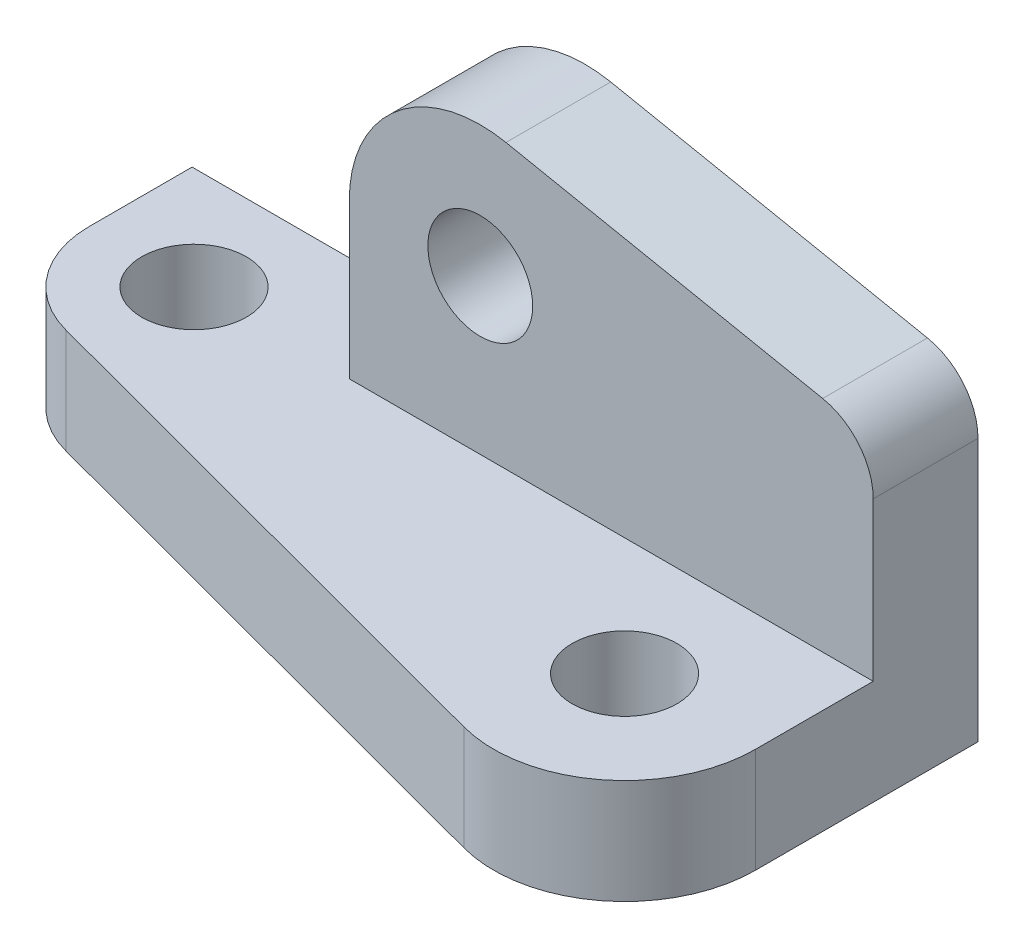
ISO-10303-21;
HEADER;
FILE_DESCRIPTION(('STEP AP214'),'2;1');
FILE_NAME('part.step','',(''),(''),'','','');
FILE_SCHEMA(('AUTOMOTIVE_DESIGN { 1 0 10303 214 1 1 1 1 }'));
ENDSEC;
DATA;
#1=APPLICATION_CONTEXT('core data for automotive mechanical design processes');
#2=APPLICATION_PROTOCOL_DEFINITION('international standard','automotive_design',2000,#1);
#3=PRODUCT_CONTEXT('',#1,'mechanical');
#4=PRODUCT('Part','Part','',(#3));
#5=PRODUCT_RELATED_PRODUCT_CATEGORY('part','',(#4));
#6=PRODUCT_DEFINITION_FORMATION('','',#4);
#7=PRODUCT_DEFINITION_CONTEXT('part definition',#1,'design');
#8=PRODUCT_DEFINITION('design','',#6,#7);
#9=PRODUCT_DEFINITION_SHAPE('','',#8);
#10=(LENGTH_UNIT() NAMED_UNIT(*) SI_UNIT(.MILLI.,.METRE.));
#11=(NAMED_UNIT(*) PLANE_ANGLE_UNIT() SI_UNIT($,.RADIAN.));
#12=(NAMED_UNIT(*) SI_UNIT($,.STERADIAN.) SOLID_ANGLE_UNIT());
#13=UNCERTAINTY_MEASURE_WITH_UNIT(LENGTH_MEASURE(1.E-05),#10,'distance_accuracy_value','');
#14=(GEOMETRIC_REPRESENTATION_CONTEXT(3) GLOBAL_UNCERTAINTY_ASSIGNED_CONTEXT((#13)) GLOBAL_UNIT_ASSIGNED_CONTEXT((#10,
#11,#12)) REPRESENTATION_CONTEXT('',''));
#15=CARTESIAN_POINT('',(0.,0.,0.));
#16=DIRECTION('',(0.,0.,1.));
#17=DIRECTION('',(1.,0.,0.));
#18=AXIS2_PLACEMENT_3D('',#15,#16,#17);
#19=CARTESIAN_POINT('',(0.,20.,35.));
#20=DIRECTION('',(1.,0.,0.));
#21=DIRECTION('',(0.,0.,-1.));
#22=AXIS2_PLACEMENT_3D('',#19,#20,#21);
#23=PLANE('',#22);
#24=DIRECTION('',(0.,0.,1.));
#25=VECTOR('',#24,1.);
#26=CARTESIAN_POINT('',(0.,0.,35.));
#27=LINE('',#26,#25);
#28=CARTESIAN_POINT('',(0.,0.,0.));
#29=VERTEX_POINT('',#28);
#30=CARTESIAN_POINT('',(0.,0.,19.63443373832));
#31=VERTEX_POINT('',#30);
#32=EDGE_CURVE('E136',#29,#31,#27,.T.);
#33=ORIENTED_EDGE('',*,*,#32,.T.);
#34=DIRECTION('',(0.,-1.,0.));
#35=VECTOR('',#34,1.);
#36=CARTESIAN_POINT('',(0.,20.,19.63443373832));
#37=LINE('',#36,#35);
#38=CARTESIAN_POINT('',(0.,20.,19.63443373832));
#39=VERTEX_POINT('',#38);
#40=EDGE_CURVE('E187',#31,#39,#37,.F.);
#41=ORIENTED_EDGE('',*,*,#40,.T.);
#42=DIRECTION('',(0.,0.,1.));
#43=VECTOR('',#42,1.);
#44=CARTESIAN_POINT('',(0.,20.,35.));
#45=LINE('',#44,#43);
#46=CARTESIAN_POINT('',(0.,20.,0.));
#47=VERTEX_POINT('',#46);
#48=EDGE_CURVE('E155',#47,#39,#45,.T.);
#49=ORIENTED_EDGE('',*,*,#48,.F.);
#50=DIRECTION('',(0.,-1.,0.));
#51=VECTOR('',#50,1.);
#52=CARTESIAN_POINT('',(0.,20.,0.));
#53=LINE('',#52,#51);
#54=EDGE_CURVE('E122',#47,#29,#53,.T.);
#55=ORIENTED_EDGE('',*,*,#54,.T.);
#56=EDGE_LOOP('',(#33,#41,#49,#55));
#57=FACE_BOUND('',#56,.T.);
#58=ADVANCED_FACE('F33',(#57),#23,.F.);
#59=CARTESIAN_POINT('',(150.,20.,75.));
#60=DIRECTION('',(0.257662650560332,0.,-0.966234939601246));
#61=DIRECTION('',(-0.966234939601246,0.,-0.257662650560332));
#62=AXIS2_PLACEMENT_3D('',#59,#60,#61);
#63=PLANE('',#62);
#64=DIRECTION('',(0.966234939601246,0.,0.257662650560332));
#65=VECTOR('',#64,1.);
#66=CARTESIAN_POINT('',(150.,0.,75.));
#67=LINE('',#66,#65);
#68=CARTESIAN_POINT('',(14.8467469887934,0.,38.9591325303449));
#69=VERTEX_POINT('',#68);
#70=CARTESIAN_POINT('',(118.558433735992,0.,66.6155823295978));
#71=VERTEX_POINT('',#70);
#72=EDGE_CURVE('E163',#69,#71,#67,.T.);
#73=ORIENTED_EDGE('',*,*,#72,.T.);
#74=DIRECTION('',(0.,-1.,0.));
#75=VECTOR('',#74,1.);
#76=CARTESIAN_POINT('',(118.558433735992,20.,66.6155823295978));
#77=LINE('',#76,#75);
#78=CARTESIAN_POINT('',(118.558433735992,20.,66.6155823295978));
#79=VERTEX_POINT('',#78);
#80=EDGE_CURVE('E41',#71,#79,#77,.F.);
#81=ORIENTED_EDGE('',*,*,#80,.T.);
#82=DIRECTION('',(0.966234939601246,0.,0.257662650560332));
#83=VECTOR('',#82,1.);
#84=CARTESIAN_POINT('',(150.,20.,75.));
#85=LINE('',#84,#83);
#86=CARTESIAN_POINT('',(14.8467469887934,20.,38.9591325303449));
#87=VERTEX_POINT('',#86);
#88=EDGE_CURVE('E157',#87,#79,#85,.T.);
#89=ORIENTED_EDGE('',*,*,#88,.F.);
#90=DIRECTION('',(0.,-1.,0.));
#91=VECTOR('',#90,1.);
#92=CARTESIAN_POINT('',(14.8467469887933,20.,38.9591325303449));
#93=LINE('',#92,#91);
#94=EDGE_CURVE('E182',#87,#69,#93,.T.);
#95=ORIENTED_EDGE('',*,*,#94,.T.);
#96=EDGE_LOOP('',(#73,#81,#89,#95));
#97=FACE_BOUND('',#96,.T.);
#98=ADVANCED_FACE('F218',(#97),#63,.F.);
#99=CARTESIAN_POINT('',(150.,20.,0.));
#100=DIRECTION('',(-1.,0.,0.));
#101=DIRECTION('',(0.,0.,1.));
#102=AXIS2_PLACEMENT_3D('',#99,#100,#101);
#103=PLANE('',#102);
#104=DIRECTION('',(0.,0.,-1.));
#105=VECTOR('',#104,1.);
#106=CARTESIAN_POINT('',(150.,20.,0.));
#107=LINE('',#106,#105);
#108=CARTESIAN_POINT('',(150.,20.,42.4597088395666));
#109=VERTEX_POINT('',#108);
#110=CARTESIAN_POINT('',(150.,20.,20.));
#111=VERTEX_POINT('',#110);
#112=EDGE_CURVE('E126',#109,#111,#107,.T.);
#113=ORIENTED_EDGE('',*,*,#112,.F.);
#114=DIRECTION('',(0.,-1.,0.));
#115=VECTOR('',#114,1.);
#116=CARTESIAN_POINT('',(150.,20.,42.4597088395666));
#117=LINE('',#116,#115);
#118=CARTESIAN_POINT('',(150.,0.,42.4597088395666));
#119=VERTEX_POINT('',#118);
#120=EDGE_CURVE('E198',#109,#119,#117,.T.);
#121=ORIENTED_EDGE('',*,*,#120,.T.);
#122=DIRECTION('',(0.,0.,-1.));
#123=VECTOR('',#122,1.);
#124=CARTESIAN_POINT('',(150.,0.,0.));
#125=LINE('',#124,#123);
#126=CARTESIAN_POINT('',(150.,0.,0.));
#127=VERTEX_POINT('',#126);
#128=EDGE_CURVE('E165',#119,#127,#125,.T.);
#129=ORIENTED_EDGE('',*,*,#128,.T.);
#130=DIRECTION('',(0.,-1.,0.));
#131=VECTOR('',#130,1.);
#132=CARTESIAN_POINT('',(150.,20.,0.));
#133=LINE('',#132,#131);
#134=CARTESIAN_POINT('',(150.,50.1623531673773,0.));
#135=VERTEX_POINT('',#134);
#136=EDGE_CURVE('E169',#135,#127,#133,.T.);
#137=ORIENTED_EDGE('',*,*,#136,.F.);
#138=DIRECTION('',(0.,0.,-1.));
#139=VECTOR('',#138,1.);
#140=CARTESIAN_POINT('',(150.,50.1623531673773,20.));
#141=LINE('',#140,#139);
#142=CARTESIAN_POINT('',(150.,50.1623531673773,20.));
#143=VERTEX_POINT('',#142);
#144=EDGE_CURVE('E177',#135,#143,#141,.F.);
#145=ORIENTED_EDGE('',*,*,#144,.T.);
#146=DIRECTION('',(0.,-1.,0.));
#147=VECTOR('',#146,1.);
#148=CARTESIAN_POINT('',(150.,0.,20.));
#149=LINE('',#148,#147);
#150=EDGE_CURVE('E151',#143,#111,#149,.T.);
#151=ORIENTED_EDGE('',*,*,#150,.T.);
#152=EDGE_LOOP('',(#113,#121,#129,#137,#145,#151));
#153=FACE_BOUND('',#152,.T.);
#154=ADVANCED_FACE('F204',(#153),#103,.F.);
#155=CARTESIAN_POINT('',(0.,20.,0.));
#156=DIRECTION('',(0.,0.,1.));
#157=DIRECTION('',(1.,0.,0.));
#158=AXIS2_PLACEMENT_3D('',#155,#156,#157);
#159=PLANE('',#158);
#160=CARTESIAN_POINT('',(75.,49.5049024320361,0.));
#161=DIRECTION('',(0.,0.,1.));
#162=DIRECTION('',(1.,0.,0.));
#163=AXIS2_PLACEMENT_3D('',#160,#161,#162);
#164=CIRCLE('',#163,9.99999999999999);
#165=CARTESIAN_POINT('',(85.,49.5049024320361,0.));
#166=VERTEX_POINT('',#165);
#167=EDGE_CURVE('E388',#166,#166,#164,.T.);
#168=ORIENTED_EDGE('',*,*,#167,.T.);
#169=EDGE_LOOP('',(#168));
#170=FACE_BOUND('',#169,.T.);
#171=DIRECTION('',(0.,1.,0.));
#172=VECTOR('',#171,1.);
#173=CARTESIAN_POINT('',(50.,80.,0.));
#174=LINE('',#173,#172);
#175=CARTESIAN_POINT('',(50.,20.,0.));
#176=VERTEX_POINT('',#175);
#177=CARTESIAN_POINT('',(50.,49.5049024320361,0.));
#178=VERTEX_POINT('',#177);
#179=EDGE_CURVE('E120',#176,#178,#174,.T.);
#180=ORIENTED_EDGE('',*,*,#179,.T.);
#181=CARTESIAN_POINT('',(75.,49.5049024320361,0.));
#182=DIRECTION('',(0.,0.,1.));
#183=DIRECTION('',(1.,0.,0.));
#184=AXIS2_PLACEMENT_3D('',#181,#182,#183);
#185=CIRCLE('',#184,25.);
#186=CARTESIAN_POINT('',(79.9029033784546,74.0194193243091,0.));
#187=VERTEX_POINT('',#186);
#188=EDGE_CURVE('E192',#178,#187,#185,.F.);
#189=ORIENTED_EDGE('',*,*,#188,.T.);
#190=DIRECTION('',(0.98058067569092,-0.196116135138184,0.));
#191=VECTOR('',#190,1.);
#192=CARTESIAN_POINT('',(150.,60.,0.));
#193=LINE('',#192,#191);
#194=CARTESIAN_POINT('',(140.353393621658,61.9293212756684,0.));
#195=VERTEX_POINT('',#194);
#196=EDGE_CURVE('E142',#187,#195,#193,.T.);
#197=ORIENTED_EDGE('',*,*,#196,.T.);
#198=CARTESIAN_POINT('',(138.,50.1623531673773,0.));
#199=DIRECTION('',(0.,0.,1.));
#200=DIRECTION('',(1.,0.,0.));
#201=AXIS2_PLACEMENT_3D('',#198,#199,#200);
#202=CIRCLE('',#201,12.);
#203=EDGE_CURVE('E175',#195,#135,#202,.F.);
#204=ORIENTED_EDGE('',*,*,#203,.T.);
#205=ORIENTED_EDGE('',*,*,#136,.T.);
#206=DIRECTION('',(-1.,0.,0.));
#207=VECTOR('',#206,1.);
#208=CARTESIAN_POINT('',(0.,0.,0.));
#209=LINE('',#208,#207);
#210=EDGE_CURVE('E158',#127,#29,#209,.T.);
#211=ORIENTED_EDGE('',*,*,#210,.T.);
#212=ORIENTED_EDGE('',*,*,#54,.F.);
#213=DIRECTION('',(-1.,0.,0.));
#214=VECTOR('',#213,1.);
#215=CARTESIAN_POINT('',(0.,20.,0.));
#216=LINE('',#215,#214);
#217=EDGE_CURVE('E116',#176,#47,#216,.T.);
#218=ORIENTED_EDGE('',*,*,#217,.F.);
#219=EDGE_LOOP('',(#180,#189,#197,#204,#205,#211,#212,#218));
#220=FACE_BOUND('',#219,.T.);
#221=ADVANCED_FACE('F118',(#170,#220),#159,.F.);
#222=CARTESIAN_POINT('',(0.,20.,0.));
#223=DIRECTION('',(0.,-1.,0.));
#224=DIRECTION('',(0.,0.,-1.));
#225=AXIS2_PLACEMENT_3D('',#222,#223,#224);
#226=PLANE('',#225);
#227=CARTESIAN_POINT('',(125.,20.,42.4597088395666));
#228=DIRECTION('',(0.,1.,0.));
#229=DIRECTION('',(0.,0.,1.));
#230=AXIS2_PLACEMENT_3D('',#227,#228,#229);
#231=CIRCLE('',#230,10.);
#232=CARTESIAN_POINT('',(125.,20.,52.4597088395666));
#233=VERTEX_POINT('',#232);
#234=EDGE_CURVE('E385',#233,#233,#231,.T.);
#235=ORIENTED_EDGE('',*,*,#234,.F.);
#236=EDGE_LOOP('',(#235));
#237=FACE_BOUND('',#236,.T.);
#238=CARTESIAN_POINT('',(20.,20.,19.63443373832));
#239=DIRECTION('',(0.,1.,0.));
#240=DIRECTION('',(0.,0.,1.));
#241=AXIS2_PLACEMENT_3D('',#238,#239,#240);
#242=CIRCLE('',#241,10.);
#243=CARTESIAN_POINT('',(20.,20.,29.63443373832));
#244=VERTEX_POINT('',#243);
#245=EDGE_CURVE('E148',#244,#244,#242,.T.);
#246=ORIENTED_EDGE('',*,*,#245,.F.);
#247=EDGE_LOOP('',(#246));
#248=FACE_BOUND('',#247,.T.);
#249=ORIENTED_EDGE('',*,*,#88,.T.);
#250=CARTESIAN_POINT('',(125.,20.,42.4597088395666));
#251=DIRECTION('',(0.,-1.,0.));
#252=DIRECTION('',(0.,0.,-1.));
#253=AXIS2_PLACEMENT_3D('',#250,#251,#252);
#254=CIRCLE('',#253,25.);
#255=EDGE_CURVE('E11',#79,#109,#254,.F.);
#256=ORIENTED_EDGE('',*,*,#255,.T.);
#257=ORIENTED_EDGE('',*,*,#112,.T.);
#258=DIRECTION('',(-1.,0.,0.));
#259=VECTOR('',#258,1.);
#260=CARTESIAN_POINT('',(0.,20.,20.));
#261=LINE('',#260,#259);
#262=CARTESIAN_POINT('',(50.,20.,20.));
#263=VERTEX_POINT('',#262);
#264=EDGE_CURVE('E132',#111,#263,#261,.T.);
#265=ORIENTED_EDGE('',*,*,#264,.T.);
#266=DIRECTION('',(0.,0.,-1.));
#267=VECTOR('',#266,1.);
#268=CARTESIAN_POINT('',(50.,20.,0.));
#269=LINE('',#268,#267);
#270=EDGE_CURVE('E129',#263,#176,#269,.T.);
#271=ORIENTED_EDGE('',*,*,#270,.T.);
#272=ORIENTED_EDGE('',*,*,#217,.T.);
#273=ORIENTED_EDGE('',*,*,#48,.T.);
#274=CARTESIAN_POINT('',(20.,20.,19.63443373832));
#275=DIRECTION('',(0.,-1.,0.));
#276=DIRECTION('',(0.,0.,-1.));
#277=AXIS2_PLACEMENT_3D('',#274,#275,#276);
#278=CIRCLE('',#277,20.);
#279=EDGE_CURVE('E189',#39,#87,#278,.F.);
#280=ORIENTED_EDGE('',*,*,#279,.T.);
#281=EDGE_LOOP('',(#249,#256,#257,#265,#271,#272,#273,#280));
#282=FACE_BOUND('',#281,.T.);
#283=ADVANCED_FACE('F130',(#237,#248,#282),#226,.F.);
#284=CARTESIAN_POINT('',(0.,0.,0.));
#285=DIRECTION('',(0.,-1.,0.));
#286=DIRECTION('',(0.,0.,-1.));
#287=AXIS2_PLACEMENT_3D('',#284,#285,#286);
#288=PLANE('',#287);
#289=CARTESIAN_POINT('',(125.,0.,42.4597088395666));
#290=DIRECTION('',(0.,1.,0.));
#291=DIRECTION('',(0.,0.,1.));
#292=AXIS2_PLACEMENT_3D('',#289,#290,#291);
#293=CIRCLE('',#292,10.);
#294=CARTESIAN_POINT('',(125.,0.,52.4597088395666));
#295=VERTEX_POINT('',#294);
#296=EDGE_CURVE('E382',#295,#295,#293,.T.);
#297=ORIENTED_EDGE('',*,*,#296,.T.);
#298=EDGE_LOOP('',(#297));
#299=FACE_BOUND('',#298,.T.);
#300=CARTESIAN_POINT('',(20.,0.,19.63443373832));
#301=DIRECTION('',(0.,1.,0.));
#302=DIRECTION('',(0.,0.,1.));
#303=AXIS2_PLACEMENT_3D('',#300,#301,#302);
#304=CIRCLE('',#303,9.99999999999999);
#305=CARTESIAN_POINT('',(20.,0.,29.63443373832));
#306=VERTEX_POINT('',#305);
#307=EDGE_CURVE('E143',#306,#306,#304,.T.);
#308=ORIENTED_EDGE('',*,*,#307,.T.);
#309=EDGE_LOOP('',(#308));
#310=FACE_BOUND('',#309,.T.);
#311=ORIENTED_EDGE('',*,*,#128,.F.);
#312=CARTESIAN_POINT('',(125.,0.,42.4597088395666));
#313=DIRECTION('',(0.,-1.,0.));
#314=DIRECTION('',(0.,0.,-1.));
#315=AXIS2_PLACEMENT_3D('',#312,#313,#314);
#316=CIRCLE('',#315,25.);
#317=EDGE_CURVE('E55',#119,#71,#316,.T.);
#318=ORIENTED_EDGE('',*,*,#317,.T.);
#319=ORIENTED_EDGE('',*,*,#72,.F.);
#320=CARTESIAN_POINT('',(20.,0.,19.63443373832));
#321=DIRECTION('',(0.,-1.,0.));
#322=DIRECTION('',(0.,0.,-1.));
#323=AXIS2_PLACEMENT_3D('',#320,#321,#322);
#324=CIRCLE('',#323,20.);
#325=EDGE_CURVE('E185',#69,#31,#324,.T.);
#326=ORIENTED_EDGE('',*,*,#325,.T.);
#327=ORIENTED_EDGE('',*,*,#32,.F.);
#328=ORIENTED_EDGE('',*,*,#210,.F.);
#329=EDGE_LOOP('',(#311,#318,#319,#326,#327,#328));
#330=FACE_BOUND('',#329,.T.);
#331=ADVANCED_FACE('F210',(#299,#310,#330),#288,.T.);
#332=CARTESIAN_POINT('',(50.,80.,20.));
#333=DIRECTION('',(-1.,0.,0.));
#334=DIRECTION('',(0.,-1.,0.));
#335=AXIS2_PLACEMENT_3D('',#332,#333,#334);
#336=PLANE('',#335);
#337=DIRECTION('',(0.,1.,0.));
#338=VECTOR('',#337,1.);
#339=CARTESIAN_POINT('',(50.,80.,20.));
#340=LINE('',#339,#338);
#341=CARTESIAN_POINT('',(50.,49.5049024320361,20.));
#342=VERTEX_POINT('',#341);
#343=EDGE_CURVE('E145',#263,#342,#340,.T.);
#344=ORIENTED_EDGE('',*,*,#343,.T.);
#345=DIRECTION('',(0.,0.,-1.));
#346=VECTOR('',#345,1.);
#347=CARTESIAN_POINT('',(50.,49.5049024320361,20.));
#348=LINE('',#347,#346);
#349=EDGE_CURVE('E141',#342,#178,#348,.T.);
#350=ORIENTED_EDGE('',*,*,#349,.T.);
#351=ORIENTED_EDGE('',*,*,#179,.F.);
#352=ORIENTED_EDGE('',*,*,#270,.F.);
#353=EDGE_LOOP('',(#344,#350,#351,#352));
#354=FACE_BOUND('',#353,.T.);
#355=ADVANCED_FACE('F139',(#354),#336,.T.);
#356=CARTESIAN_POINT('',(0.,0.,20.));
#357=DIRECTION('',(0.,0.,1.));
#358=DIRECTION('',(1.,0.,0.));
#359=AXIS2_PLACEMENT_3D('',#356,#357,#358);
#360=PLANE('',#359);
#361=CARTESIAN_POINT('',(75.,49.5049024320361,20.));
#362=DIRECTION('',(0.,0.,1.));
#363=DIRECTION('',(1.,0.,0.));
#364=AXIS2_PLACEMENT_3D('',#361,#362,#363);
#365=CIRCLE('',#364,9.99999999999999);
#366=CARTESIAN_POINT('',(85.,49.5049024320361,20.));
#367=VERTEX_POINT('',#366);
#368=EDGE_CURVE('E391',#367,#367,#365,.T.);
#369=ORIENTED_EDGE('',*,*,#368,.F.);
#370=EDGE_LOOP('',(#369));
#371=FACE_BOUND('',#370,.T.);
#372=DIRECTION('',(0.98058067569092,-0.196116135138184,0.));
#373=VECTOR('',#372,1.);
#374=CARTESIAN_POINT('',(150.,60.,20.));
#375=LINE('',#374,#373);
#376=CARTESIAN_POINT('',(79.9029033784546,74.0194193243091,20.));
#377=VERTEX_POINT('',#376);
#378=CARTESIAN_POINT('',(140.353393621658,61.9293212756684,20.));
#379=VERTEX_POINT('',#378);
#380=EDGE_CURVE('E377',#377,#379,#375,.T.);
#381=ORIENTED_EDGE('',*,*,#380,.F.);
#382=CARTESIAN_POINT('',(75.,49.5049024320361,20.));
#383=DIRECTION('',(0.,0.,1.));
#384=DIRECTION('',(1.,0.,0.));
#385=AXIS2_PLACEMENT_3D('',#382,#383,#384);
#386=CIRCLE('',#385,25.);
#387=EDGE_CURVE('E196',#377,#342,#386,.T.);
#388=ORIENTED_EDGE('',*,*,#387,.T.);
#389=ORIENTED_EDGE('',*,*,#343,.F.);
#390=ORIENTED_EDGE('',*,*,#264,.F.);
#391=ORIENTED_EDGE('',*,*,#150,.F.);
#392=CARTESIAN_POINT('',(138.,50.1623531673773,20.));
#393=DIRECTION('',(0.,0.,1.));
#394=DIRECTION('',(1.,0.,0.));
#395=AXIS2_PLACEMENT_3D('',#392,#393,#394);
#396=CIRCLE('',#395,12.);
#397=EDGE_CURVE('E179',#143,#379,#396,.T.);
#398=ORIENTED_EDGE('',*,*,#397,.T.);
#399=EDGE_LOOP('',(#381,#388,#389,#390,#391,#398));
#400=FACE_BOUND('',#399,.T.);
#401=ADVANCED_FACE('F317',(#371,#400),#360,.T.);
#402=CARTESIAN_POINT('',(150.,60.,20.));
#403=DIRECTION('',(0.196116135138184,0.98058067569092,0.));
#404=DIRECTION('',(-0.98058067569092,0.196116135138184,0.));
#405=AXIS2_PLACEMENT_3D('',#402,#403,#404);
#406=PLANE('',#405);
#407=ORIENTED_EDGE('',*,*,#196,.F.);
#408=DIRECTION('',(0.,0.,-1.));
#409=VECTOR('',#408,1.);
#410=CARTESIAN_POINT('',(79.9029033784546,74.0194193243091,20.));
#411=LINE('',#410,#409);
#412=EDGE_CURVE('E194',#187,#377,#411,.F.);
#413=ORIENTED_EDGE('',*,*,#412,.T.);
#414=ORIENTED_EDGE('',*,*,#380,.T.);
#415=DIRECTION('',(0.,0.,-1.));
#416=VECTOR('',#415,1.);
#417=CARTESIAN_POINT('',(140.353393621658,61.9293212756684,0.));
#418=LINE('',#417,#416);
#419=EDGE_CURVE('E172',#379,#195,#418,.T.);
#420=ORIENTED_EDGE('',*,*,#419,.T.);
#421=EDGE_LOOP('',(#407,#413,#414,#420));
#422=FACE_BOUND('',#421,.T.);
#423=ADVANCED_FACE('F241',(#422),#406,.T.);
#424=CARTESIAN_POINT('',(138.,50.1623531673773,20.));
#425=DIRECTION('',(0.,0.,1.));
#426=DIRECTION('',(1.,0.,0.));
#427=AXIS2_PLACEMENT_3D('',#424,#425,#426);
#428=CYLINDRICAL_SURFACE('',#427,12.);
#429=ORIENTED_EDGE('',*,*,#397,.F.);
#430=ORIENTED_EDGE('',*,*,#144,.F.);
#431=ORIENTED_EDGE('',*,*,#203,.F.);
#432=ORIENTED_EDGE('',*,*,#419,.F.);
#433=EDGE_LOOP('',(#429,#430,#431,#432));
#434=FACE_BOUND('',#433,.T.);
#435=ADVANCED_FACE('F238',(#434),#428,.T.);
#436=CARTESIAN_POINT('',(20.,20.,19.63443373832));
#437=DIRECTION('',(0.,-1.,0.));
#438=DIRECTION('',(0.,0.,-1.));
#439=AXIS2_PLACEMENT_3D('',#436,#437,#438);
#440=CYLINDRICAL_SURFACE('',#439,20.);
#441=ORIENTED_EDGE('',*,*,#279,.F.);
#442=ORIENTED_EDGE('',*,*,#40,.F.);
#443=ORIENTED_EDGE('',*,*,#325,.F.);
#444=ORIENTED_EDGE('',*,*,#94,.F.);
#445=EDGE_LOOP('',(#441,#442,#443,#444));
#446=FACE_BOUND('',#445,.T.);
#447=ADVANCED_FACE('F217',(#446),#440,.T.);
#448=CARTESIAN_POINT('',(75.,49.5049024320361,20.));
#449=DIRECTION('',(0.,0.,-1.));
#450=DIRECTION('',(-1.,0.,0.));
#451=AXIS2_PLACEMENT_3D('',#448,#449,#450);
#452=CYLINDRICAL_SURFACE('',#451,25.);
#453=ORIENTED_EDGE('',*,*,#387,.F.);
#454=ORIENTED_EDGE('',*,*,#412,.F.);
#455=ORIENTED_EDGE('',*,*,#188,.F.);
#456=ORIENTED_EDGE('',*,*,#349,.F.);
#457=EDGE_LOOP('',(#453,#454,#455,#456));
#458=FACE_BOUND('',#457,.T.);
#459=ADVANCED_FACE('F221',(#458),#452,.T.);
#460=CARTESIAN_POINT('',(125.,20.,42.4597088395666));
#461=DIRECTION('',(0.,-1.,0.));
#462=DIRECTION('',(0.,0.,-1.));
#463=AXIS2_PLACEMENT_3D('',#460,#461,#462);
#464=CYLINDRICAL_SURFACE('',#463,25.);
#465=ORIENTED_EDGE('',*,*,#255,.F.);
#466=ORIENTED_EDGE('',*,*,#80,.F.);
#467=ORIENTED_EDGE('',*,*,#317,.F.);
#468=ORIENTED_EDGE('',*,*,#120,.F.);
#469=EDGE_LOOP('',(#465,#466,#467,#468));
#470=FACE_BOUND('',#469,.T.);
#471=ADVANCED_FACE('F35',(#470),#464,.T.);
#472=CARTESIAN_POINT('',(20.,20.,19.63443373832));
#473=DIRECTION('',(0.,1.,0.));
#474=DIRECTION('',(0.,0.,1.));
#475=AXIS2_PLACEMENT_3D('',#472,#473,#474);
#476=CYLINDRICAL_SURFACE('',#475,10.);
#477=ORIENTED_EDGE('',*,*,#307,.F.);
#478=EDGE_LOOP('',(#477));
#479=FACE_BOUND('',#478,.T.);
#480=ORIENTED_EDGE('',*,*,#245,.T.);
#481=EDGE_LOOP('',(#480));
#482=FACE_BOUND('',#481,.T.);
#483=ADVANCED_FACE('F220',(#479,#482),#476,.F.);
#484=CARTESIAN_POINT('',(125.,20.,42.4597088395666));
#485=DIRECTION('',(0.,1.,0.));
#486=DIRECTION('',(0.,0.,1.));
#487=AXIS2_PLACEMENT_3D('',#484,#485,#486);
#488=CYLINDRICAL_SURFACE('',#487,10.);
#489=ORIENTED_EDGE('',*,*,#296,.F.);
#490=EDGE_LOOP('',(#489));
#491=FACE_BOUND('',#490,.T.);
#492=ORIENTED_EDGE('',*,*,#234,.T.);
#493=EDGE_LOOP('',(#492));
#494=FACE_BOUND('',#493,.T.);
#495=ADVANCED_FACE('F226',(#491,#494),#488,.F.);
#496=CARTESIAN_POINT('',(75.,49.5049024320361,20.));
#497=DIRECTION('',(0.,0.,1.));
#498=DIRECTION('',(1.,0.,0.));
#499=AXIS2_PLACEMENT_3D('',#496,#497,#498);
#500=CYLINDRICAL_SURFACE('',#499,9.99999999999999);
#501=ORIENTED_EDGE('',*,*,#167,.F.);
#502=EDGE_LOOP('',(#501));
#503=FACE_BOUND('',#502,.T.);
#504=ORIENTED_EDGE('',*,*,#368,.T.);
#505=EDGE_LOOP('',(#504));
#506=FACE_BOUND('',#505,.T.);
#507=ADVANCED_FACE('F299',(#503,#506),#500,.F.);
#508=CLOSED_SHELL('',(#58,#98,#154,#221,#283,#331,#355,#401,#423,#435,#447,#459,#471,#483,#495,#507));
#509=MANIFOLD_SOLID_BREP('B2',#508);
#510=ADVANCED_BREP_SHAPE_REPRESENTATION('',(#18,#509),#14);
#511=SHAPE_DEFINITION_REPRESENTATION(#9,#510);
ENDSEC;
END-ISO-10303-21;
